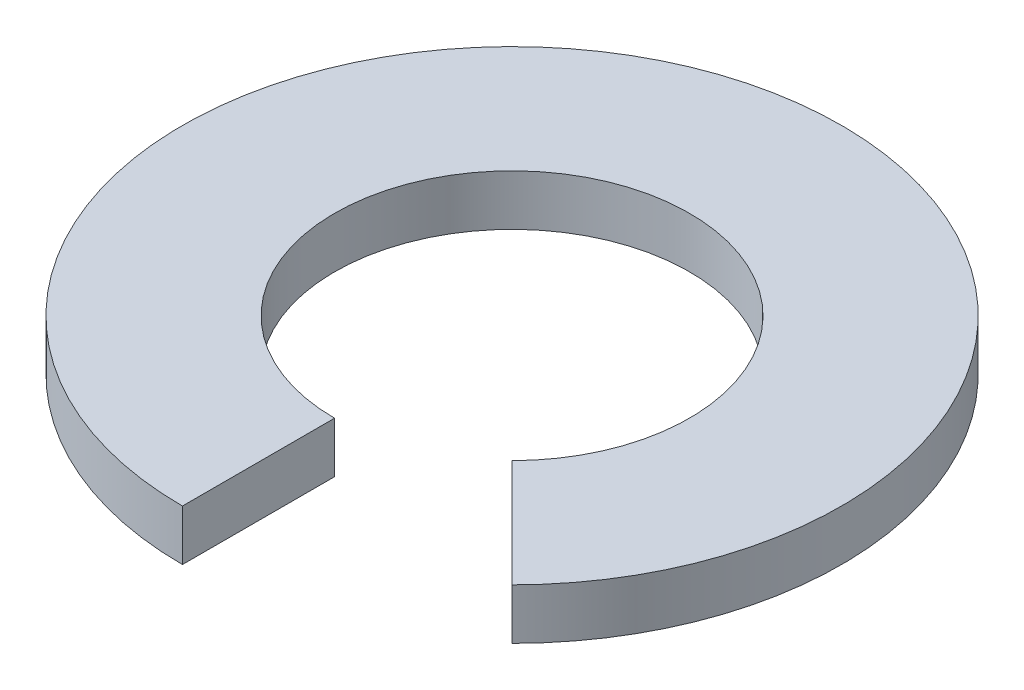
ISO-10303-21;
HEADER;
FILE_DESCRIPTION(('STEP AP214'),'2;1');
FILE_NAME('part.step','',(''),(''),'','','');
FILE_SCHEMA(('AUTOMOTIVE_DESIGN { 1 0 10303 214 1 1 1 1 }'));
ENDSEC;
DATA;
#1=APPLICATION_CONTEXT('core data for automotive mechanical design processes');
#2=APPLICATION_PROTOCOL_DEFINITION('international standard','automotive_design',2000,#1);
#3=PRODUCT_CONTEXT('',#1,'mechanical');
#4=PRODUCT('Part','Part','',(#3));
#5=PRODUCT_RELATED_PRODUCT_CATEGORY('part','',(#4));
#6=PRODUCT_DEFINITION_FORMATION('','',#4);
#7=PRODUCT_DEFINITION_CONTEXT('part definition',#1,'design');
#8=PRODUCT_DEFINITION('design','',#6,#7);
#9=PRODUCT_DEFINITION_SHAPE('','',#8);
#10=(LENGTH_UNIT() NAMED_UNIT(*) SI_UNIT(.MILLI.,.METRE.));
#11=(NAMED_UNIT(*) PLANE_ANGLE_UNIT() SI_UNIT($,.RADIAN.));
#12=(NAMED_UNIT(*) SI_UNIT($,.STERADIAN.) SOLID_ANGLE_UNIT());
#13=UNCERTAINTY_MEASURE_WITH_UNIT(LENGTH_MEASURE(1.E-05),#10,'distance_accuracy_value','');
#14=(GEOMETRIC_REPRESENTATION_CONTEXT(3) GLOBAL_UNCERTAINTY_ASSIGNED_CONTEXT((#13)) GLOBAL_UNIT_ASSIGNED_CONTEXT((#10,
#11,#12)) REPRESENTATION_CONTEXT('',''));
#15=CARTESIAN_POINT('',(0.,0.,0.));
#16=DIRECTION('',(0.,0.,1.));
#17=DIRECTION('',(1.,0.,0.));
#18=AXIS2_PLACEMENT_3D('',#15,#16,#17);
#19=CARTESIAN_POINT('',(0.,1.,0.));
#20=DIRECTION('',(0.,-1.,0.));
#21=DIRECTION('',(0.,0.,-1.));
#22=AXIS2_PLACEMENT_3D('',#19,#20,#21);
#23=CYLINDRICAL_SURFACE('',#22,3.5);
#24=CARTESIAN_POINT('',(0.,0.,0.));
#25=DIRECTION('',(0.,-1.,0.));
#26=DIRECTION('',(0.,0.,1.));
#27=AXIS2_PLACEMENT_3D('',#24,#25,#26);
#28=CIRCLE('',#27,3.5);
#29=CARTESIAN_POINT('',(0.,0.,3.5));
#30=VERTEX_POINT('',#29);
#31=CARTESIAN_POINT('',(2.47487373415292,0.,2.47487373415291));
#32=VERTEX_POINT('',#31);
#33=EDGE_CURVE('E95',#30,#32,#28,.T.);
#34=ORIENTED_EDGE('',*,*,#33,.T.);
#35=DIRECTION('',(0.,-1.,0.));
#36=VECTOR('',#35,1.);
#37=CARTESIAN_POINT('',(2.47487373415292,1.,2.47487373415291));
#38=LINE('',#37,#36);
#39=CARTESIAN_POINT('',(2.47487373415292,1.,2.47487373415291));
#40=VERTEX_POINT('',#39);
#41=EDGE_CURVE('E11',#40,#32,#38,.T.);
#42=ORIENTED_EDGE('',*,*,#41,.F.);
#43=CARTESIAN_POINT('',(0.,1.,0.));
#44=DIRECTION('',(0.,-1.,0.));
#45=DIRECTION('',(0.,0.,1.));
#46=AXIS2_PLACEMENT_3D('',#43,#44,#45);
#47=CIRCLE('',#46,3.5);
#48=CARTESIAN_POINT('',(0.,1.,3.5));
#49=VERTEX_POINT('',#48);
#50=EDGE_CURVE('E83',#49,#40,#47,.T.);
#51=ORIENTED_EDGE('',*,*,#50,.F.);
#52=DIRECTION('',(0.,-1.,0.));
#53=VECTOR('',#52,1.);
#54=CARTESIAN_POINT('',(0.,1.,3.5));
#55=LINE('',#54,#53);
#56=EDGE_CURVE('E91',#49,#30,#55,.T.);
#57=ORIENTED_EDGE('',*,*,#56,.T.);
#58=EDGE_LOOP('',(#34,#42,#51,#57));
#59=FACE_BOUND('',#58,.T.);
#60=ADVANCED_FACE('F32',(#59),#23,.F.);
#61=CARTESIAN_POINT('',(2.47487373415292,1.,2.47487373415291));
#62=DIRECTION('',(0.707106781186546,0.,-0.707106781186549));
#63=DIRECTION('',(-0.707106781186549,0.,-0.707106781186546));
#64=AXIS2_PLACEMENT_3D('',#61,#62,#63);
#65=PLANE('',#64);
#66=DIRECTION('',(0.707106781186549,0.,0.707106781186546));
#67=VECTOR('',#66,1.);
#68=CARTESIAN_POINT('',(2.47487373415292,0.,2.47487373415291));
#69=LINE('',#68,#67);
#70=CARTESIAN_POINT('',(4.59619407771257,0.,4.59619407771255));
#71=VERTEX_POINT('',#70);
#72=EDGE_CURVE('E87',#32,#71,#69,.T.);
#73=ORIENTED_EDGE('',*,*,#72,.T.);
#74=DIRECTION('',(0.,-1.,0.));
#75=VECTOR('',#74,1.);
#76=CARTESIAN_POINT('',(4.59619407771257,1.,4.59619407771255));
#77=LINE('',#76,#75);
#78=CARTESIAN_POINT('',(4.59619407771257,1.,4.59619407771255));
#79=VERTEX_POINT('',#78);
#80=EDGE_CURVE('E40',#79,#71,#77,.T.);
#81=ORIENTED_EDGE('',*,*,#80,.F.);
#82=DIRECTION('',(0.707106781186549,0.,0.707106781186546));
#83=VECTOR('',#82,1.);
#84=CARTESIAN_POINT('',(2.47487373415292,1.,2.47487373415291));
#85=LINE('',#84,#83);
#86=EDGE_CURVE('E78',#40,#79,#85,.T.);
#87=ORIENTED_EDGE('',*,*,#86,.F.);
#88=ORIENTED_EDGE('',*,*,#41,.T.);
#89=EDGE_LOOP('',(#73,#81,#87,#88));
#90=FACE_BOUND('',#89,.T.);
#91=ADVANCED_FACE('F86',(#90),#65,.F.);
#92=CARTESIAN_POINT('',(0.,1.,0.));
#93=DIRECTION('',(0.,-1.,0.));
#94=DIRECTION('',(0.,0.,-1.));
#95=AXIS2_PLACEMENT_3D('',#92,#93,#94);
#96=CYLINDRICAL_SURFACE('',#95,6.5);
#97=CARTESIAN_POINT('',(0.,0.,0.));
#98=DIRECTION('',(0.,1.,0.));
#99=DIRECTION('',(0.,0.,1.));
#100=AXIS2_PLACEMENT_3D('',#97,#98,#99);
#101=CIRCLE('',#100,6.5);
#102=CARTESIAN_POINT('',(0.,0.,6.5));
#103=VERTEX_POINT('',#102);
#104=EDGE_CURVE('E65',#71,#103,#101,.T.);
#105=ORIENTED_EDGE('',*,*,#104,.T.);
#106=DIRECTION('',(0.,-1.,0.));
#107=VECTOR('',#106,1.);
#108=CARTESIAN_POINT('',(0.,1.,6.5));
#109=LINE('',#108,#107);
#110=CARTESIAN_POINT('',(0.,1.,6.5));
#111=VERTEX_POINT('',#110);
#112=EDGE_CURVE('E88',#111,#103,#109,.T.);
#113=ORIENTED_EDGE('',*,*,#112,.F.);
#114=CARTESIAN_POINT('',(0.,1.,0.));
#115=DIRECTION('',(0.,1.,0.));
#116=DIRECTION('',(0.,0.,1.));
#117=AXIS2_PLACEMENT_3D('',#114,#115,#116);
#118=CIRCLE('',#117,6.5);
#119=EDGE_CURVE('E81',#79,#111,#118,.T.);
#120=ORIENTED_EDGE('',*,*,#119,.F.);
#121=ORIENTED_EDGE('',*,*,#80,.T.);
#122=EDGE_LOOP('',(#105,#113,#120,#121));
#123=FACE_BOUND('',#122,.T.);
#124=ADVANCED_FACE('F89',(#123),#96,.T.);
#125=CARTESIAN_POINT('',(0.,1.,3.5));
#126=DIRECTION('',(-1.,0.,0.));
#127=DIRECTION('',(0.,0.,1.));
#128=AXIS2_PLACEMENT_3D('',#125,#126,#127);
#129=PLANE('',#128);
#130=DIRECTION('',(0.,0.,-1.));
#131=VECTOR('',#130,1.);
#132=CARTESIAN_POINT('',(0.,0.,3.5));
#133=LINE('',#132,#131);
#134=EDGE_CURVE('E71',#103,#30,#133,.T.);
#135=ORIENTED_EDGE('',*,*,#134,.T.);
#136=ORIENTED_EDGE('',*,*,#56,.F.);
#137=DIRECTION('',(0.,0.,-1.));
#138=VECTOR('',#137,1.);
#139=CARTESIAN_POINT('',(0.,1.,3.5));
#140=LINE('',#139,#138);
#141=EDGE_CURVE('E48',#111,#49,#140,.T.);
#142=ORIENTED_EDGE('',*,*,#141,.F.);
#143=ORIENTED_EDGE('',*,*,#112,.T.);
#144=EDGE_LOOP('',(#135,#136,#142,#143));
#145=FACE_BOUND('',#144,.T.);
#146=ADVANCED_FACE('F102',(#145),#129,.F.);
#147=CARTESIAN_POINT('',(0.,1.,0.));
#148=DIRECTION('',(0.,1.,0.));
#149=DIRECTION('',(0.,0.,1.));
#150=AXIS2_PLACEMENT_3D('',#147,#148,#149);
#151=PLANE('',#150);
#152=ORIENTED_EDGE('',*,*,#50,.T.);
#153=ORIENTED_EDGE('',*,*,#86,.T.);
#154=ORIENTED_EDGE('',*,*,#119,.T.);
#155=ORIENTED_EDGE('',*,*,#141,.T.);
#156=EDGE_LOOP('',(#152,#153,#154,#155));
#157=FACE_BOUND('',#156,.T.);
#158=ADVANCED_FACE('F79',(#157),#151,.T.);
#159=CARTESIAN_POINT('',(0.,0.,0.));
#160=DIRECTION('',(0.,1.,0.));
#161=DIRECTION('',(0.,0.,1.));
#162=AXIS2_PLACEMENT_3D('',#159,#160,#161);
#163=PLANE('',#162);
#164=ORIENTED_EDGE('',*,*,#33,.F.);
#165=ORIENTED_EDGE('',*,*,#134,.F.);
#166=ORIENTED_EDGE('',*,*,#104,.F.);
#167=ORIENTED_EDGE('',*,*,#72,.F.);
#168=EDGE_LOOP('',(#164,#165,#166,#167));
#169=FACE_BOUND('',#168,.T.);
#170=ADVANCED_FACE('F105',(#169),#163,.F.);
#171=CLOSED_SHELL('',(#60,#91,#124,#146,#158,#170));
#172=MANIFOLD_SOLID_BREP('B2',#171);
#173=ADVANCED_BREP_SHAPE_REPRESENTATION('',(#18,#172),#14);
#174=SHAPE_DEFINITION_REPRESENTATION(#9,#173);
ENDSEC;
END-ISO-10303-21;
